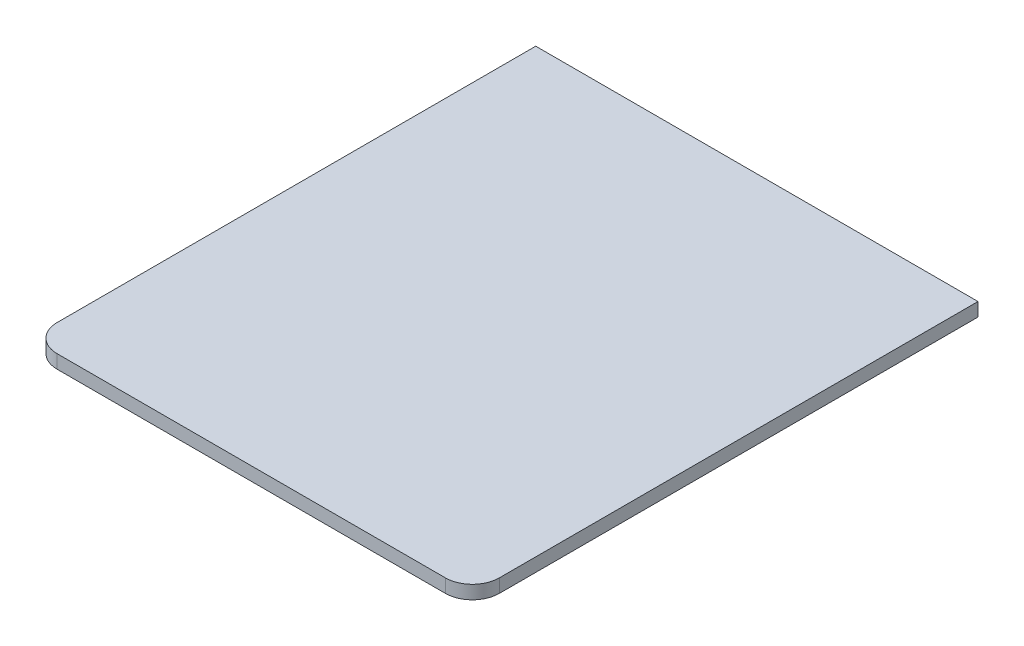
ISO-10303-21;
HEADER;
FILE_DESCRIPTION(('STEP AP214'),'2;1');
FILE_NAME('part.step','',(''),(''),'','','');
FILE_SCHEMA(('AUTOMOTIVE_DESIGN { 1 0 10303 214 1 1 1 1 }'));
ENDSEC;
DATA;
#1=APPLICATION_CONTEXT('core data for automotive mechanical design processes');
#2=APPLICATION_PROTOCOL_DEFINITION('international standard','automotive_design',2000,#1);
#3=PRODUCT_CONTEXT('',#1,'mechanical');
#4=PRODUCT('Part','Part','',(#3));
#5=PRODUCT_RELATED_PRODUCT_CATEGORY('part','',(#4));
#6=PRODUCT_DEFINITION_FORMATION('','',#4);
#7=PRODUCT_DEFINITION_CONTEXT('part definition',#1,'design');
#8=PRODUCT_DEFINITION('design','',#6,#7);
#9=PRODUCT_DEFINITION_SHAPE('','',#8);
#10=(LENGTH_UNIT() NAMED_UNIT(*) SI_UNIT(.MILLI.,.METRE.));
#11=(NAMED_UNIT(*) PLANE_ANGLE_UNIT() SI_UNIT($,.RADIAN.));
#12=(NAMED_UNIT(*) SI_UNIT($,.STERADIAN.) SOLID_ANGLE_UNIT());
#13=UNCERTAINTY_MEASURE_WITH_UNIT(LENGTH_MEASURE(1.E-05),#10,'distance_accuracy_value','');
#14=(GEOMETRIC_REPRESENTATION_CONTEXT(3) GLOBAL_UNCERTAINTY_ASSIGNED_CONTEXT((#13)) GLOBAL_UNIT_ASSIGNED_CONTEXT((#10,
#11,#12)) REPRESENTATION_CONTEXT('',''));
#15=CARTESIAN_POINT('',(0.,0.,0.));
#16=DIRECTION('',(0.,0.,1.));
#17=DIRECTION('',(1.,0.,0.));
#18=AXIS2_PLACEMENT_3D('',#15,#16,#17);
#19=CARTESIAN_POINT('',(0.,-1.,0.));
#20=DIRECTION('',(-1.,0.,0.));
#21=DIRECTION('',(0.,0.,1.));
#22=AXIS2_PLACEMENT_3D('',#19,#20,#21);
#23=PLANE('',#22);
#24=DIRECTION('',(0.,0.,1.));
#25=VECTOR('',#24,1.);
#26=CARTESIAN_POINT('',(0.,-1.,0.));
#27=LINE('',#26,#25);
#28=CARTESIAN_POINT('',(0.,-1.,-37.5));
#29=VERTEX_POINT('',#28);
#30=CARTESIAN_POINT('',(0.,-1.,-2.));
#31=VERTEX_POINT('',#30);
#32=EDGE_CURVE('E110',#29,#31,#27,.T.);
#33=ORIENTED_EDGE('',*,*,#32,.T.);
#34=DIRECTION('',(0.,1.,0.));
#35=VECTOR('',#34,1.);
#36=CARTESIAN_POINT('',(0.,-1.,-2.));
#37=LINE('',#36,#35);
#38=CARTESIAN_POINT('',(0.,0.,-2.));
#39=VERTEX_POINT('',#38);
#40=EDGE_CURVE('E11',#31,#39,#37,.T.);
#41=ORIENTED_EDGE('',*,*,#40,.T.);
#42=DIRECTION('',(0.,0.,1.));
#43=VECTOR('',#42,1.);
#44=CARTESIAN_POINT('',(0.,0.,0.));
#45=LINE('',#44,#43);
#46=CARTESIAN_POINT('',(0.,0.,-37.5));
#47=VERTEX_POINT('',#46);
#48=EDGE_CURVE('E114',#47,#39,#45,.T.);
#49=ORIENTED_EDGE('',*,*,#48,.F.);
#50=DIRECTION('',(0.,1.,0.));
#51=VECTOR('',#50,1.);
#52=CARTESIAN_POINT('',(0.,-1.,-37.5));
#53=LINE('',#52,#51);
#54=EDGE_CURVE('E107',#29,#47,#53,.T.);
#55=ORIENTED_EDGE('',*,*,#54,.F.);
#56=EDGE_LOOP('',(#33,#41,#49,#55));
#57=FACE_BOUND('',#56,.T.);
#58=ADVANCED_FACE('F38',(#57),#23,.T.);
#59=CARTESIAN_POINT('',(0.,-1.,-37.5));
#60=DIRECTION('',(0.,0.,-1.));
#61=DIRECTION('',(-1.,0.,0.));
#62=AXIS2_PLACEMENT_3D('',#59,#60,#61);
#63=PLANE('',#62);
#64=DIRECTION('',(-1.,0.,0.));
#65=VECTOR('',#64,1.);
#66=CARTESIAN_POINT('',(0.,0.,-37.5));
#67=LINE('',#66,#65);
#68=CARTESIAN_POINT('',(32.8,0.,-37.5));
#69=VERTEX_POINT('',#68);
#70=EDGE_CURVE('E106',#69,#47,#67,.T.);
#71=ORIENTED_EDGE('',*,*,#70,.F.);
#72=DIRECTION('',(0.,1.,0.));
#73=VECTOR('',#72,1.);
#74=CARTESIAN_POINT('',(32.8,-1.,-37.5));
#75=LINE('',#74,#73);
#76=CARTESIAN_POINT('',(32.8,-1.,-37.5));
#77=VERTEX_POINT('',#76);
#78=EDGE_CURVE('E95',#77,#69,#75,.T.);
#79=ORIENTED_EDGE('',*,*,#78,.F.);
#80=DIRECTION('',(-1.,0.,0.));
#81=VECTOR('',#80,1.);
#82=CARTESIAN_POINT('',(0.,-1.,-37.5));
#83=LINE('',#82,#81);
#84=EDGE_CURVE('E99',#77,#29,#83,.T.);
#85=ORIENTED_EDGE('',*,*,#84,.T.);
#86=ORIENTED_EDGE('',*,*,#54,.T.);
#87=EDGE_LOOP('',(#71,#79,#85,#86));
#88=FACE_BOUND('',#87,.T.);
#89=ADVANCED_FACE('F104',(#88),#63,.T.);
#90=CARTESIAN_POINT('',(32.8,-1.,0.));
#91=DIRECTION('',(1.,0.,0.));
#92=DIRECTION('',(0.,0.,-1.));
#93=AXIS2_PLACEMENT_3D('',#90,#91,#92);
#94=PLANE('',#93);
#95=DIRECTION('',(0.,0.,-1.));
#96=VECTOR('',#95,1.);
#97=CARTESIAN_POINT('',(32.8,0.,0.));
#98=LINE('',#97,#96);
#99=CARTESIAN_POINT('',(32.8,0.,-2.));
#100=VERTEX_POINT('',#99);
#101=EDGE_CURVE('E120',#100,#69,#98,.T.);
#102=ORIENTED_EDGE('',*,*,#101,.F.);
#103=DIRECTION('',(0.,1.,0.));
#104=VECTOR('',#103,1.);
#105=CARTESIAN_POINT('',(32.8,-1.,-2.));
#106=LINE('',#105,#104);
#107=CARTESIAN_POINT('',(32.8,-1.,-2.));
#108=VERTEX_POINT('',#107);
#109=EDGE_CURVE('E61',#100,#108,#106,.F.);
#110=ORIENTED_EDGE('',*,*,#109,.T.);
#111=DIRECTION('',(0.,0.,-1.));
#112=VECTOR('',#111,1.);
#113=CARTESIAN_POINT('',(32.8,-1.,0.));
#114=LINE('',#113,#112);
#115=EDGE_CURVE('E92',#108,#77,#114,.T.);
#116=ORIENTED_EDGE('',*,*,#115,.T.);
#117=ORIENTED_EDGE('',*,*,#78,.T.);
#118=EDGE_LOOP('',(#102,#110,#116,#117));
#119=FACE_BOUND('',#118,.T.);
#120=ADVANCED_FACE('F94',(#119),#94,.T.);
#121=CARTESIAN_POINT('',(0.,-1.,0.));
#122=DIRECTION('',(0.,0.,1.));
#123=DIRECTION('',(1.,0.,0.));
#124=AXIS2_PLACEMENT_3D('',#121,#122,#123);
#125=PLANE('',#124);
#126=DIRECTION('',(1.,0.,0.));
#127=VECTOR('',#126,1.);
#128=CARTESIAN_POINT('',(0.,-1.,0.));
#129=LINE('',#128,#127);
#130=CARTESIAN_POINT('',(2.,-1.,0.));
#131=VERTEX_POINT('',#130);
#132=CARTESIAN_POINT('',(30.8,-1.,0.));
#133=VERTEX_POINT('',#132);
#134=EDGE_CURVE('E100',#131,#133,#129,.T.);
#135=ORIENTED_EDGE('',*,*,#134,.T.);
#136=DIRECTION('',(0.,1.,0.));
#137=VECTOR('',#136,1.);
#138=CARTESIAN_POINT('',(30.8,-1.,0.));
#139=LINE('',#138,#137);
#140=CARTESIAN_POINT('',(30.8,0.,0.));
#141=VERTEX_POINT('',#140);
#142=EDGE_CURVE('E126',#133,#141,#139,.T.);
#143=ORIENTED_EDGE('',*,*,#142,.T.);
#144=DIRECTION('',(1.,0.,0.));
#145=VECTOR('',#144,1.);
#146=CARTESIAN_POINT('',(0.,0.,0.));
#147=LINE('',#146,#145);
#148=CARTESIAN_POINT('',(2.,0.,0.));
#149=VERTEX_POINT('',#148);
#150=EDGE_CURVE('E117',#149,#141,#147,.T.);
#151=ORIENTED_EDGE('',*,*,#150,.F.);
#152=DIRECTION('',(0.,1.,0.));
#153=VECTOR('',#152,1.);
#154=CARTESIAN_POINT('',(2.,-1.,0.));
#155=LINE('',#154,#153);
#156=EDGE_CURVE('E123',#149,#131,#155,.F.);
#157=ORIENTED_EDGE('',*,*,#156,.T.);
#158=EDGE_LOOP('',(#135,#143,#151,#157));
#159=FACE_BOUND('',#158,.T.);
#160=ADVANCED_FACE('F138',(#159),#125,.T.);
#161=CARTESIAN_POINT('',(0.,-1.,0.));
#162=DIRECTION('',(0.,-1.,0.));
#163=DIRECTION('',(0.,0.,-1.));
#164=AXIS2_PLACEMENT_3D('',#161,#162,#163);
#165=PLANE('',#164);
#166=ORIENTED_EDGE('',*,*,#115,.F.);
#167=CARTESIAN_POINT('',(30.8,-1.,-2.));
#168=DIRECTION('',(0.,-1.,0.));
#169=DIRECTION('',(0.,0.,-1.));
#170=AXIS2_PLACEMENT_3D('',#167,#168,#169);
#171=CIRCLE('',#170,2.);
#172=EDGE_CURVE('E46',#108,#133,#171,.T.);
#173=ORIENTED_EDGE('',*,*,#172,.T.);
#174=ORIENTED_EDGE('',*,*,#134,.F.);
#175=CARTESIAN_POINT('',(2.,-1.,-2.));
#176=DIRECTION('',(0.,-1.,0.));
#177=DIRECTION('',(0.,0.,-1.));
#178=AXIS2_PLACEMENT_3D('',#175,#176,#177);
#179=CIRCLE('',#178,2.);
#180=EDGE_CURVE('E53',#131,#31,#179,.T.);
#181=ORIENTED_EDGE('',*,*,#180,.T.);
#182=ORIENTED_EDGE('',*,*,#32,.F.);
#183=ORIENTED_EDGE('',*,*,#84,.F.);
#184=EDGE_LOOP('',(#166,#173,#174,#181,#182,#183));
#185=FACE_BOUND('',#184,.T.);
#186=ADVANCED_FACE('F109',(#185),#165,.T.);
#187=CARTESIAN_POINT('',(0.,0.,0.));
#188=DIRECTION('',(0.,-1.,0.));
#189=DIRECTION('',(0.,0.,-1.));
#190=AXIS2_PLACEMENT_3D('',#187,#188,#189);
#191=PLANE('',#190);
#192=ORIENTED_EDGE('',*,*,#150,.T.);
#193=CARTESIAN_POINT('',(30.8,0.,-2.));
#194=DIRECTION('',(0.,-1.,0.));
#195=DIRECTION('',(0.,0.,-1.));
#196=AXIS2_PLACEMENT_3D('',#193,#194,#195);
#197=CIRCLE('',#196,2.);
#198=EDGE_CURVE('E131',#141,#100,#197,.F.);
#199=ORIENTED_EDGE('',*,*,#198,.T.);
#200=ORIENTED_EDGE('',*,*,#101,.T.);
#201=ORIENTED_EDGE('',*,*,#70,.T.);
#202=ORIENTED_EDGE('',*,*,#48,.T.);
#203=CARTESIAN_POINT('',(2.,0.,-2.));
#204=DIRECTION('',(0.,-1.,0.));
#205=DIRECTION('',(0.,0.,-1.));
#206=AXIS2_PLACEMENT_3D('',#203,#204,#205);
#207=CIRCLE('',#206,2.);
#208=EDGE_CURVE('E129',#39,#149,#207,.F.);
#209=ORIENTED_EDGE('',*,*,#208,.T.);
#210=EDGE_LOOP('',(#192,#199,#200,#201,#202,#209));
#211=FACE_BOUND('',#210,.T.);
#212=ADVANCED_FACE('F143',(#211),#191,.F.);
#213=CARTESIAN_POINT('',(30.8,-1.,-2.));
#214=DIRECTION('',(0.,1.,0.));
#215=DIRECTION('',(0.,0.,1.));
#216=AXIS2_PLACEMENT_3D('',#213,#214,#215);
#217=CYLINDRICAL_SURFACE('',#216,2.);
#218=ORIENTED_EDGE('',*,*,#172,.F.);
#219=ORIENTED_EDGE('',*,*,#109,.F.);
#220=ORIENTED_EDGE('',*,*,#198,.F.);
#221=ORIENTED_EDGE('',*,*,#142,.F.);
#222=EDGE_LOOP('',(#218,#219,#220,#221));
#223=FACE_BOUND('',#222,.T.);
#224=ADVANCED_FACE('F141',(#223),#217,.T.);
#225=CARTESIAN_POINT('',(2.,-1.,-2.));
#226=DIRECTION('',(0.,1.,0.));
#227=DIRECTION('',(0.,0.,1.));
#228=AXIS2_PLACEMENT_3D('',#225,#226,#227);
#229=CYLINDRICAL_SURFACE('',#228,2.);
#230=ORIENTED_EDGE('',*,*,#180,.F.);
#231=ORIENTED_EDGE('',*,*,#156,.F.);
#232=ORIENTED_EDGE('',*,*,#208,.F.);
#233=ORIENTED_EDGE('',*,*,#40,.F.);
#234=EDGE_LOOP('',(#230,#231,#232,#233));
#235=FACE_BOUND('',#234,.T.);
#236=ADVANCED_FACE('F40',(#235),#229,.T.);
#237=CLOSED_SHELL('',(#58,#89,#120,#160,#186,#212,#224,#236));
#238=MANIFOLD_SOLID_BREP('B2',#237);
#239=ADVANCED_BREP_SHAPE_REPRESENTATION('',(#18,#238),#14);
#240=SHAPE_DEFINITION_REPRESENTATION(#9,#239);
ENDSEC;
END-ISO-10303-21;
